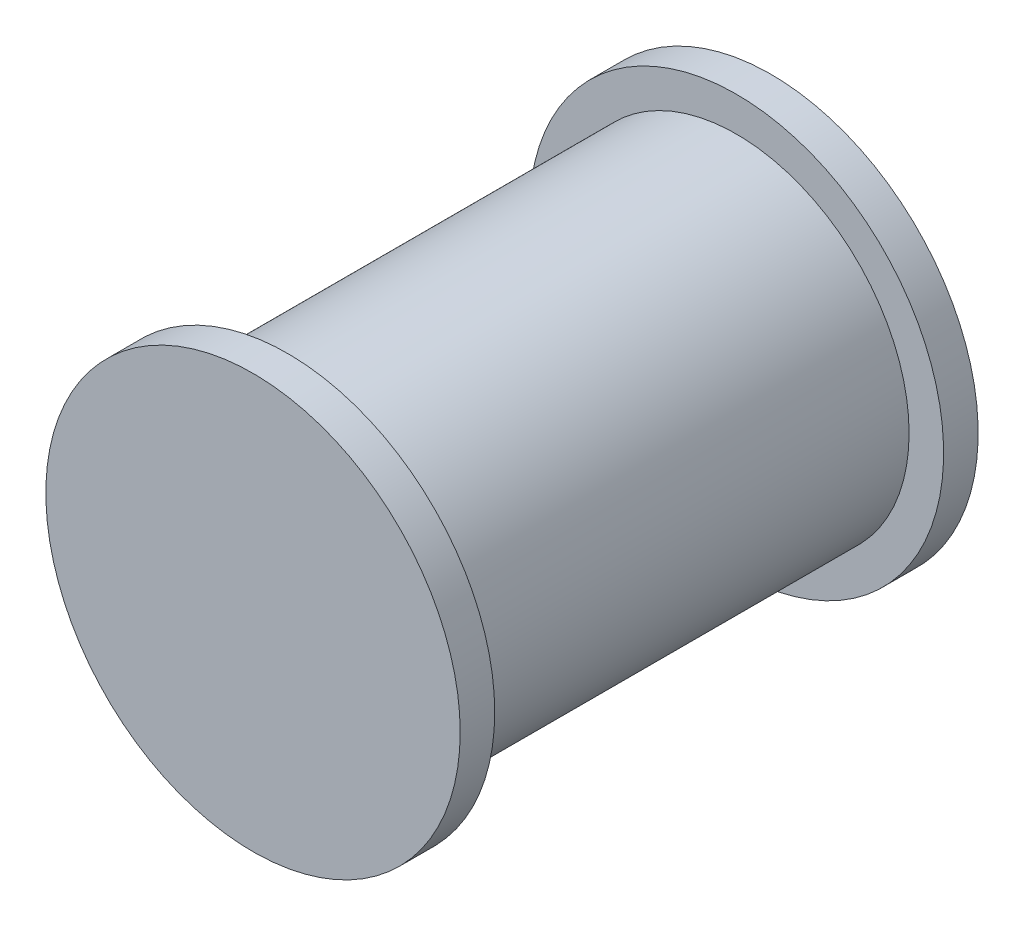
ISO-10303-21;
HEADER;
FILE_DESCRIPTION(('STEP AP214'),'2;1');
FILE_NAME('part.step','',(''),(''),'','','');
FILE_SCHEMA(('AUTOMOTIVE_DESIGN { 1 0 10303 214 1 1 1 1 }'));
ENDSEC;
DATA;
#1=APPLICATION_CONTEXT('core data for automotive mechanical design processes');
#2=APPLICATION_PROTOCOL_DEFINITION('international standard','automotive_design',2000,#1);
#3=PRODUCT_CONTEXT('',#1,'mechanical');
#4=PRODUCT('Part','Part','',(#3));
#5=PRODUCT_RELATED_PRODUCT_CATEGORY('part','',(#4));
#6=PRODUCT_DEFINITION_FORMATION('','',#4);
#7=PRODUCT_DEFINITION_CONTEXT('part definition',#1,'design');
#8=PRODUCT_DEFINITION('design','',#6,#7);
#9=PRODUCT_DEFINITION_SHAPE('','',#8);
#10=(LENGTH_UNIT() NAMED_UNIT(*) SI_UNIT(.MILLI.,.METRE.));
#11=(NAMED_UNIT(*) PLANE_ANGLE_UNIT() SI_UNIT($,.RADIAN.));
#12=(NAMED_UNIT(*) SI_UNIT($,.STERADIAN.) SOLID_ANGLE_UNIT());
#13=UNCERTAINTY_MEASURE_WITH_UNIT(LENGTH_MEASURE(1.E-05),#10,'distance_accuracy_value','');
#14=(GEOMETRIC_REPRESENTATION_CONTEXT(3) GLOBAL_UNCERTAINTY_ASSIGNED_CONTEXT((#13)) GLOBAL_UNIT_ASSIGNED_CONTEXT((#10,
#11,#12)) REPRESENTATION_CONTEXT('',''));
#15=CARTESIAN_POINT('',(0.,0.,0.));
#16=DIRECTION('',(0.,0.,1.));
#17=DIRECTION('',(1.,0.,0.));
#18=AXIS2_PLACEMENT_3D('',#15,#16,#17);
#19=CARTESIAN_POINT('',(0.,0.,30.));
#20=DIRECTION('',(0.,0.,-1.));
#21=DIRECTION('',(-1.,0.,0.));
#22=AXIS2_PLACEMENT_3D('',#19,#20,#21);
#23=CYLINDRICAL_SURFACE('',#22,10.);
#24=CARTESIAN_POINT('',(0.,0.,28.));
#25=DIRECTION('',(0.,0.,1.));
#26=DIRECTION('',(1.,0.,0.));
#27=AXIS2_PLACEMENT_3D('',#24,#25,#26);
#28=CIRCLE('',#27,10.);
#29=CARTESIAN_POINT('',(10.,0.,28.));
#30=VERTEX_POINT('',#29);
#31=EDGE_CURVE('E55',#30,#30,#28,.T.);
#32=ORIENTED_EDGE('',*,*,#31,.F.);
#33=EDGE_LOOP('',(#32));
#34=FACE_BOUND('',#33,.T.);
#35=CARTESIAN_POINT('',(0.,0.,2.));
#36=DIRECTION('',(0.,0.,-1.));
#37=DIRECTION('',(-1.,0.,0.));
#38=AXIS2_PLACEMENT_3D('',#35,#36,#37);
#39=CIRCLE('',#38,10.);
#40=CARTESIAN_POINT('',(-10.,0.,2.));
#41=VERTEX_POINT('',#40);
#42=EDGE_CURVE('E11',#41,#41,#39,.T.);
#43=ORIENTED_EDGE('',*,*,#42,.F.);
#44=EDGE_LOOP('',(#43));
#45=FACE_BOUND('',#44,.T.);
#46=ADVANCED_FACE('F49',(#34,#45),#23,.T.);
#47=CARTESIAN_POINT('',(0.,0.,28.));
#48=DIRECTION('',(0.,0.,1.));
#49=DIRECTION('',(1.,0.,0.));
#50=AXIS2_PLACEMENT_3D('',#47,#48,#49);
#51=CYLINDRICAL_SURFACE('',#50,12.);
#52=CARTESIAN_POINT('',(0.,0.,28.));
#53=DIRECTION('',(0.,0.,1.));
#54=DIRECTION('',(1.,0.,0.));
#55=AXIS2_PLACEMENT_3D('',#52,#53,#54);
#56=CIRCLE('',#55,12.);
#57=CARTESIAN_POINT('',(12.,0.,28.));
#58=VERTEX_POINT('',#57);
#59=EDGE_CURVE('E59',#58,#58,#56,.T.);
#60=ORIENTED_EDGE('',*,*,#59,.T.);
#61=EDGE_LOOP('',(#60));
#62=FACE_BOUND('',#61,.T.);
#63=CARTESIAN_POINT('',(0.,0.,30.));
#64=DIRECTION('',(0.,0.,1.));
#65=DIRECTION('',(1.,0.,0.));
#66=AXIS2_PLACEMENT_3D('',#63,#64,#65);
#67=CIRCLE('',#66,12.);
#68=CARTESIAN_POINT('',(12.,0.,30.));
#69=VERTEX_POINT('',#68);
#70=EDGE_CURVE('E63',#69,#69,#67,.T.);
#71=ORIENTED_EDGE('',*,*,#70,.F.);
#72=EDGE_LOOP('',(#71));
#73=FACE_BOUND('',#72,.T.);
#74=ADVANCED_FACE('F90',(#62,#73),#51,.T.);
#75=CARTESIAN_POINT('',(0.,0.,28.));
#76=DIRECTION('',(0.,0.,1.));
#77=DIRECTION('',(1.,0.,0.));
#78=AXIS2_PLACEMENT_3D('',#75,#76,#77);
#79=PLANE('',#78);
#80=ORIENTED_EDGE('',*,*,#31,.T.);
#81=EDGE_LOOP('',(#80));
#82=FACE_BOUND('',#81,.T.);
#83=ORIENTED_EDGE('',*,*,#59,.F.);
#84=EDGE_LOOP('',(#83));
#85=FACE_BOUND('',#84,.T.);
#86=ADVANCED_FACE('F96',(#82,#85),#79,.F.);
#87=CARTESIAN_POINT('',(0.,0.,30.));
#88=DIRECTION('',(0.,0.,1.));
#89=DIRECTION('',(1.,0.,0.));
#90=AXIS2_PLACEMENT_3D('',#87,#88,#89);
#91=PLANE('',#90);
#92=ORIENTED_EDGE('',*,*,#70,.T.);
#93=EDGE_LOOP('',(#92));
#94=FACE_BOUND('',#93,.T.);
#95=ADVANCED_FACE('F87',(#94),#91,.T.);
#96=CARTESIAN_POINT('',(0.,0.,2.));
#97=DIRECTION('',(0.,0.,-1.));
#98=DIRECTION('',(-1.,0.,0.));
#99=AXIS2_PLACEMENT_3D('',#96,#97,#98);
#100=CYLINDRICAL_SURFACE('',#99,12.);
#101=CARTESIAN_POINT('',(0.,0.,2.));
#102=DIRECTION('',(0.,0.,-1.));
#103=DIRECTION('',(-1.,0.,0.));
#104=AXIS2_PLACEMENT_3D('',#101,#102,#103);
#105=CIRCLE('',#104,12.);
#106=CARTESIAN_POINT('',(-12.,0.,2.));
#107=VERTEX_POINT('',#106);
#108=EDGE_CURVE('E67',#107,#107,#105,.T.);
#109=ORIENTED_EDGE('',*,*,#108,.T.);
#110=EDGE_LOOP('',(#109));
#111=FACE_BOUND('',#110,.T.);
#112=CARTESIAN_POINT('',(0.,0.,0.));
#113=DIRECTION('',(0.,0.,-1.));
#114=DIRECTION('',(-1.,0.,0.));
#115=AXIS2_PLACEMENT_3D('',#112,#113,#114);
#116=CIRCLE('',#115,12.);
#117=CARTESIAN_POINT('',(-12.,0.,0.));
#118=VERTEX_POINT('',#117);
#119=EDGE_CURVE('E69',#118,#118,#116,.T.);
#120=ORIENTED_EDGE('',*,*,#119,.F.);
#121=EDGE_LOOP('',(#120));
#122=FACE_BOUND('',#121,.T.);
#123=ADVANCED_FACE('F75',(#111,#122),#100,.T.);
#124=CARTESIAN_POINT('',(0.,0.,2.));
#125=DIRECTION('',(0.,0.,-1.));
#126=DIRECTION('',(-1.,0.,0.));
#127=AXIS2_PLACEMENT_3D('',#124,#125,#126);
#128=PLANE('',#127);
#129=ORIENTED_EDGE('',*,*,#42,.T.);
#130=EDGE_LOOP('',(#129));
#131=FACE_BOUND('',#130,.T.);
#132=ORIENTED_EDGE('',*,*,#108,.F.);
#133=EDGE_LOOP('',(#132));
#134=FACE_BOUND('',#133,.T.);
#135=ADVANCED_FACE('F78',(#131,#134),#128,.F.);
#136=CARTESIAN_POINT('',(0.,0.,0.));
#137=DIRECTION('',(0.,0.,1.));
#138=DIRECTION('',(1.,0.,0.));
#139=AXIS2_PLACEMENT_3D('',#136,#137,#138);
#140=PLANE('',#139);
#141=ORIENTED_EDGE('',*,*,#119,.T.);
#142=EDGE_LOOP('',(#141));
#143=FACE_BOUND('',#142,.T.);
#144=ADVANCED_FACE('F80',(#143),#140,.F.);
#145=CLOSED_SHELL('',(#46,#74,#86,#95,#123,#135,#144));
#146=MANIFOLD_SOLID_BREP('B2',#145);
#147=ADVANCED_BREP_SHAPE_REPRESENTATION('',(#18,#146),#14);
#148=SHAPE_DEFINITION_REPRESENTATION(#9,#147);
ENDSEC;
END-ISO-10303-21;
